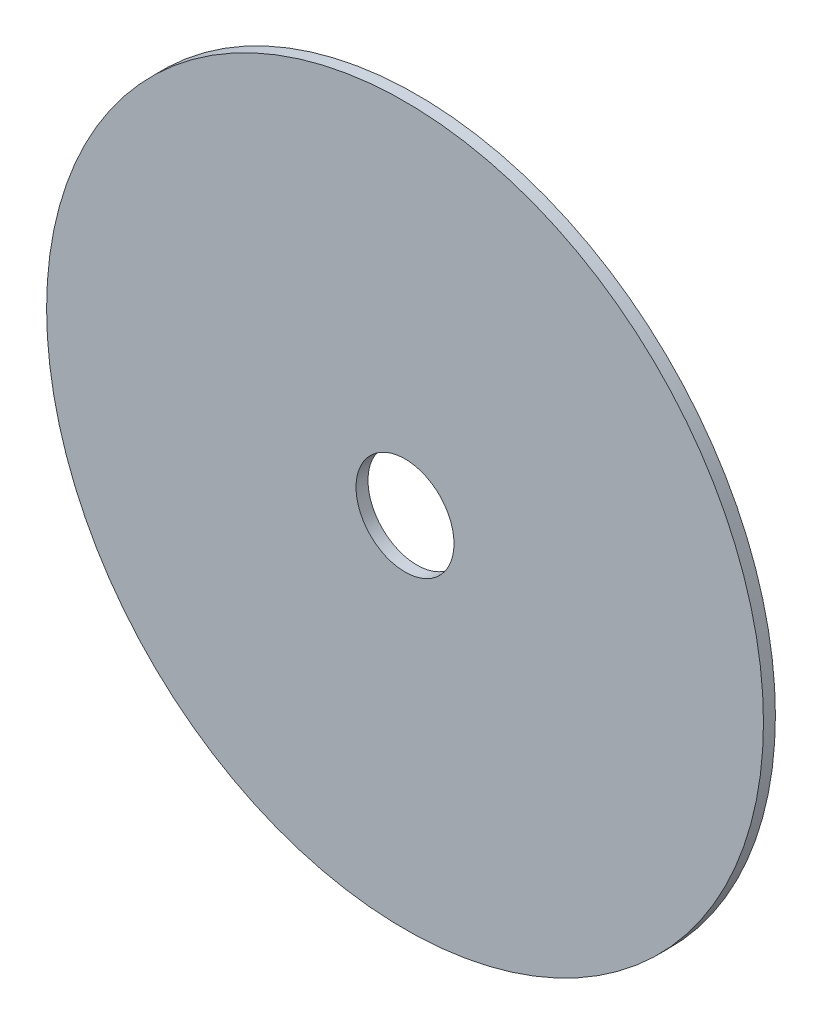
ISO-10303-21;
HEADER;
FILE_DESCRIPTION(('STEP AP214'),'2;1');
FILE_NAME('part.step','',(''),(''),'','','');
FILE_SCHEMA(('AUTOMOTIVE_DESIGN { 1 0 10303 214 1 1 1 1 }'));
ENDSEC;
DATA;
#1=APPLICATION_CONTEXT('core data for automotive mechanical design processes');
#2=APPLICATION_PROTOCOL_DEFINITION('international standard','automotive_design',2000,#1);
#3=PRODUCT_CONTEXT('',#1,'mechanical');
#4=PRODUCT('Part','Part','',(#3));
#5=PRODUCT_RELATED_PRODUCT_CATEGORY('part','',(#4));
#6=PRODUCT_DEFINITION_FORMATION('','',#4);
#7=PRODUCT_DEFINITION_CONTEXT('part definition',#1,'design');
#8=PRODUCT_DEFINITION('design','',#6,#7);
#9=PRODUCT_DEFINITION_SHAPE('','',#8);
#10=(LENGTH_UNIT() NAMED_UNIT(*) SI_UNIT(.MILLI.,.METRE.));
#11=(NAMED_UNIT(*) PLANE_ANGLE_UNIT() SI_UNIT($,.RADIAN.));
#12=(NAMED_UNIT(*) SI_UNIT($,.STERADIAN.) SOLID_ANGLE_UNIT());
#13=UNCERTAINTY_MEASURE_WITH_UNIT(LENGTH_MEASURE(1.E-05),#10,'distance_accuracy_value','');
#14=(GEOMETRIC_REPRESENTATION_CONTEXT(3) GLOBAL_UNCERTAINTY_ASSIGNED_CONTEXT((#13)) GLOBAL_UNIT_ASSIGNED_CONTEXT((#10,
#11,#12)) REPRESENTATION_CONTEXT('',''));
#15=CARTESIAN_POINT('',(0.,0.,0.));
#16=DIRECTION('',(0.,0.,1.));
#17=DIRECTION('',(1.,0.,0.));
#18=AXIS2_PLACEMENT_3D('',#15,#16,#17);
#19=CARTESIAN_POINT('',(0.,0.,1.));
#20=DIRECTION('',(0.,0.,1.));
#21=DIRECTION('',(1.,0.,0.));
#22=AXIS2_PLACEMENT_3D('',#19,#20,#21);
#23=PLANE('',#22);
#24=CARTESIAN_POINT('',(0.,0.,1.));
#25=DIRECTION('',(0.,0.,1.));
#26=DIRECTION('',(1.,0.,0.));
#27=AXIS2_PLACEMENT_3D('',#24,#25,#26);
#28=CIRCLE('',#27,30.);
#29=CARTESIAN_POINT('',(30.,0.,1.));
#30=VERTEX_POINT('',#29);
#31=EDGE_CURVE('E10',#30,#30,#28,.T.);
#32=ORIENTED_EDGE('',*,*,#31,.T.);
#33=EDGE_LOOP('',(#32));
#34=FACE_BOUND('',#33,.T.);
#35=CARTESIAN_POINT('',(0.,0.,1.));
#36=DIRECTION('',(0.,0.,1.));
#37=DIRECTION('',(1.,0.,0.));
#38=AXIS2_PLACEMENT_3D('',#35,#36,#37);
#39=CIRCLE('',#38,4.1);
#40=CARTESIAN_POINT('',(4.1,0.,1.));
#41=VERTEX_POINT('',#40);
#42=EDGE_CURVE('E50',#41,#41,#39,.T.);
#43=ORIENTED_EDGE('',*,*,#42,.F.);
#44=EDGE_LOOP('',(#43));
#45=FACE_BOUND('',#44,.T.);
#46=ADVANCED_FACE('F37',(#34,#45),#23,.T.);
#47=CARTESIAN_POINT('',(0.,0.,0.));
#48=DIRECTION('',(0.,0.,1.));
#49=DIRECTION('',(1.,0.,0.));
#50=AXIS2_PLACEMENT_3D('',#47,#48,#49);
#51=PLANE('',#50);
#52=CARTESIAN_POINT('',(0.,0.,0.));
#53=DIRECTION('',(0.,0.,1.));
#54=DIRECTION('',(1.,0.,0.));
#55=AXIS2_PLACEMENT_3D('',#52,#53,#54);
#56=CIRCLE('',#55,30.);
#57=CARTESIAN_POINT('',(30.,0.,0.));
#58=VERTEX_POINT('',#57);
#59=EDGE_CURVE('E41',#58,#58,#56,.T.);
#60=ORIENTED_EDGE('',*,*,#59,.F.);
#61=EDGE_LOOP('',(#60));
#62=FACE_BOUND('',#61,.T.);
#63=CARTESIAN_POINT('',(0.,0.,0.));
#64=DIRECTION('',(0.,0.,1.));
#65=DIRECTION('',(1.,0.,0.));
#66=AXIS2_PLACEMENT_3D('',#63,#64,#65);
#67=CIRCLE('',#66,4.1);
#68=CARTESIAN_POINT('',(4.1,0.,0.));
#69=VERTEX_POINT('',#68);
#70=EDGE_CURVE('E52',#69,#69,#67,.T.);
#71=ORIENTED_EDGE('',*,*,#70,.T.);
#72=EDGE_LOOP('',(#71));
#73=FACE_BOUND('',#72,.T.);
#74=ADVANCED_FACE('F64',(#62,#73),#51,.F.);
#75=CARTESIAN_POINT('',(0.,0.,1.));
#76=DIRECTION('',(0.,0.,-1.));
#77=DIRECTION('',(-1.,0.,0.));
#78=AXIS2_PLACEMENT_3D('',#75,#76,#77);
#79=CYLINDRICAL_SURFACE('',#78,30.);
#80=ORIENTED_EDGE('',*,*,#31,.F.);
#81=EDGE_LOOP('',(#80));
#82=FACE_BOUND('',#81,.T.);
#83=ORIENTED_EDGE('',*,*,#59,.T.);
#84=EDGE_LOOP('',(#83));
#85=FACE_BOUND('',#84,.T.);
#86=ADVANCED_FACE('F39',(#82,#85),#79,.T.);
#87=CARTESIAN_POINT('',(0.,0.,1.));
#88=DIRECTION('',(0.,0.,-1.));
#89=DIRECTION('',(-1.,0.,0.));
#90=AXIS2_PLACEMENT_3D('',#87,#88,#89);
#91=CYLINDRICAL_SURFACE('',#90,4.1);
#92=ORIENTED_EDGE('',*,*,#42,.T.);
#93=EDGE_LOOP('',(#92));
#94=FACE_BOUND('',#93,.T.);
#95=ORIENTED_EDGE('',*,*,#70,.F.);
#96=EDGE_LOOP('',(#95));
#97=FACE_BOUND('',#96,.T.);
#98=ADVANCED_FACE('F60',(#94,#97),#91,.F.);
#99=CLOSED_SHELL('',(#46,#74,#86,#98));
#100=MANIFOLD_SOLID_BREP('B2',#99);
#101=ADVANCED_BREP_SHAPE_REPRESENTATION('',(#18,#100),#14);
#102=SHAPE_DEFINITION_REPRESENTATION(#9,#101);
ENDSEC;
END-ISO-10303-21;
